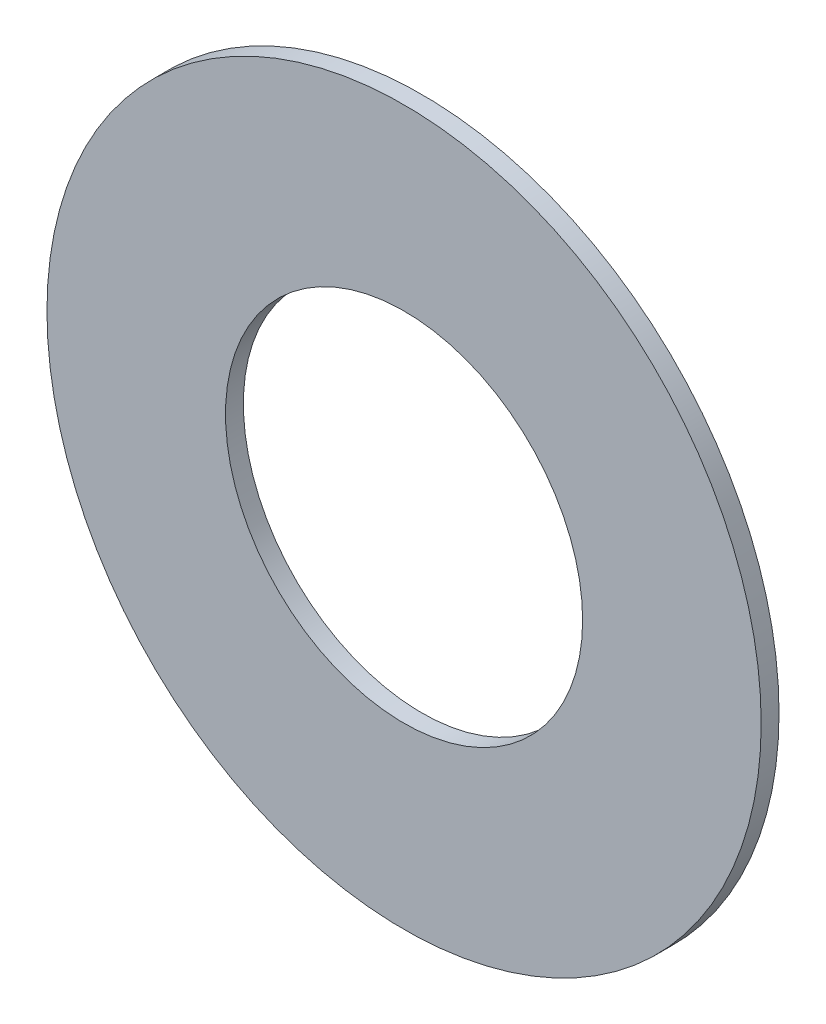
ISO-10303-21;
HEADER;
FILE_DESCRIPTION(('STEP AP214'),'2;1');
FILE_NAME('part.step','',(''),(''),'','','');
FILE_SCHEMA(('AUTOMOTIVE_DESIGN { 1 0 10303 214 1 1 1 1 }'));
ENDSEC;
DATA;
#1=APPLICATION_CONTEXT('core data for automotive mechanical design processes');
#2=APPLICATION_PROTOCOL_DEFINITION('international standard','automotive_design',2000,#1);
#3=PRODUCT_CONTEXT('',#1,'mechanical');
#4=PRODUCT('Part','Part','',(#3));
#5=PRODUCT_RELATED_PRODUCT_CATEGORY('part','',(#4));
#6=PRODUCT_DEFINITION_FORMATION('','',#4);
#7=PRODUCT_DEFINITION_CONTEXT('part definition',#1,'design');
#8=PRODUCT_DEFINITION('design','',#6,#7);
#9=PRODUCT_DEFINITION_SHAPE('','',#8);
#10=(LENGTH_UNIT() NAMED_UNIT(*) SI_UNIT(.MILLI.,.METRE.));
#11=(NAMED_UNIT(*) PLANE_ANGLE_UNIT() SI_UNIT($,.RADIAN.));
#12=(NAMED_UNIT(*) SI_UNIT($,.STERADIAN.) SOLID_ANGLE_UNIT());
#13=UNCERTAINTY_MEASURE_WITH_UNIT(LENGTH_MEASURE(1.E-05),#10,'distance_accuracy_value','');
#14=(GEOMETRIC_REPRESENTATION_CONTEXT(3) GLOBAL_UNCERTAINTY_ASSIGNED_CONTEXT((#13)) GLOBAL_UNIT_ASSIGNED_CONTEXT((#10,
#11,#12)) REPRESENTATION_CONTEXT('',''));
#15=CARTESIAN_POINT('',(0.,0.,0.));
#16=DIRECTION('',(0.,0.,1.));
#17=DIRECTION('',(1.,0.,0.));
#18=AXIS2_PLACEMENT_3D('',#15,#16,#17);
#19=CARTESIAN_POINT('',(0.,0.,0.3));
#20=DIRECTION('',(0.,0.,-1.));
#21=DIRECTION('',(-1.,0.,0.));
#22=AXIS2_PLACEMENT_3D('',#19,#20,#21);
#23=PLANE('',#22);
#24=CARTESIAN_POINT('',(0.,0.,0.3));
#25=DIRECTION('',(0.,0.,1.));
#26=DIRECTION('',(1.,0.,0.));
#27=AXIS2_PLACEMENT_3D('',#24,#25,#26);
#28=CIRCLE('',#27,3.);
#29=CARTESIAN_POINT('',(3.,0.,0.3));
#30=VERTEX_POINT('',#29);
#31=EDGE_CURVE('E27',#30,#30,#28,.F.);
#32=ORIENTED_EDGE('',*,*,#31,.T.);
#33=EDGE_LOOP('',(#32));
#34=FACE_BOUND('',#33,.T.);
#35=CARTESIAN_POINT('',(0.,0.,0.3));
#36=DIRECTION('',(0.,0.,1.));
#37=DIRECTION('',(1.,0.,0.));
#38=AXIS2_PLACEMENT_3D('',#35,#36,#37);
#39=CIRCLE('',#38,6.);
#40=CARTESIAN_POINT('',(6.,0.,0.3));
#41=VERTEX_POINT('',#40);
#42=EDGE_CURVE('E18',#41,#41,#39,.F.);
#43=ORIENTED_EDGE('',*,*,#42,.F.);
#44=EDGE_LOOP('',(#43));
#45=FACE_BOUND('',#44,.T.);
#46=ADVANCED_FACE('F15',(#34,#45),#23,.F.);
#47=CARTESIAN_POINT('',(0.,0.,0.));
#48=DIRECTION('',(0.,0.,1.));
#49=DIRECTION('',(1.,0.,0.));
#50=AXIS2_PLACEMENT_3D('',#47,#48,#49);
#51=CYLINDRICAL_SURFACE('',#50,6.);
#52=CARTESIAN_POINT('',(0.,0.,0.));
#53=DIRECTION('',(0.,0.,1.));
#54=DIRECTION('',(1.,0.,0.));
#55=AXIS2_PLACEMENT_3D('',#52,#53,#54);
#56=CIRCLE('',#55,6.);
#57=CARTESIAN_POINT('',(6.,0.,0.));
#58=VERTEX_POINT('',#57);
#59=EDGE_CURVE('E22',#58,#58,#56,.F.);
#60=ORIENTED_EDGE('',*,*,#59,.F.);
#61=EDGE_LOOP('',(#60));
#62=FACE_BOUND('',#61,.T.);
#63=ORIENTED_EDGE('',*,*,#42,.T.);
#64=EDGE_LOOP('',(#63));
#65=FACE_BOUND('',#64,.T.);
#66=ADVANCED_FACE('F35',(#62,#65),#51,.T.);
#67=CARTESIAN_POINT('',(0.,0.,0.));
#68=DIRECTION('',(0.,0.,1.));
#69=DIRECTION('',(1.,0.,0.));
#70=AXIS2_PLACEMENT_3D('',#67,#68,#69);
#71=CYLINDRICAL_SURFACE('',#70,3.);
#72=CARTESIAN_POINT('',(0.,0.,0.));
#73=DIRECTION('',(0.,0.,1.));
#74=DIRECTION('',(1.,0.,0.));
#75=AXIS2_PLACEMENT_3D('',#72,#73,#74);
#76=CIRCLE('',#75,3.);
#77=CARTESIAN_POINT('',(3.,0.,0.));
#78=VERTEX_POINT('',#77);
#79=EDGE_CURVE('E10',#78,#78,#76,.T.);
#80=ORIENTED_EDGE('',*,*,#79,.F.);
#81=EDGE_LOOP('',(#80));
#82=FACE_BOUND('',#81,.T.);
#83=ORIENTED_EDGE('',*,*,#31,.F.);
#84=EDGE_LOOP('',(#83));
#85=FACE_BOUND('',#84,.T.);
#86=ADVANCED_FACE('F42',(#82,#85),#71,.F.);
#87=CARTESIAN_POINT('',(0.,0.,0.));
#88=DIRECTION('',(0.,0.,-1.));
#89=DIRECTION('',(-1.,0.,0.));
#90=AXIS2_PLACEMENT_3D('',#87,#88,#89);
#91=PLANE('',#90);
#92=ORIENTED_EDGE('',*,*,#79,.T.);
#93=EDGE_LOOP('',(#92));
#94=FACE_BOUND('',#93,.T.);
#95=ORIENTED_EDGE('',*,*,#59,.T.);
#96=EDGE_LOOP('',(#95));
#97=FACE_BOUND('',#96,.T.);
#98=ADVANCED_FACE('F44',(#94,#97),#91,.T.);
#99=CLOSED_SHELL('',(#46,#66,#86,#98));
#100=MANIFOLD_SOLID_BREP('B1',#99);
#101=ADVANCED_BREP_SHAPE_REPRESENTATION('',(#18,#100),#14);
#102=SHAPE_DEFINITION_REPRESENTATION(#9,#101);
ENDSEC;
END-ISO-10303-21;
